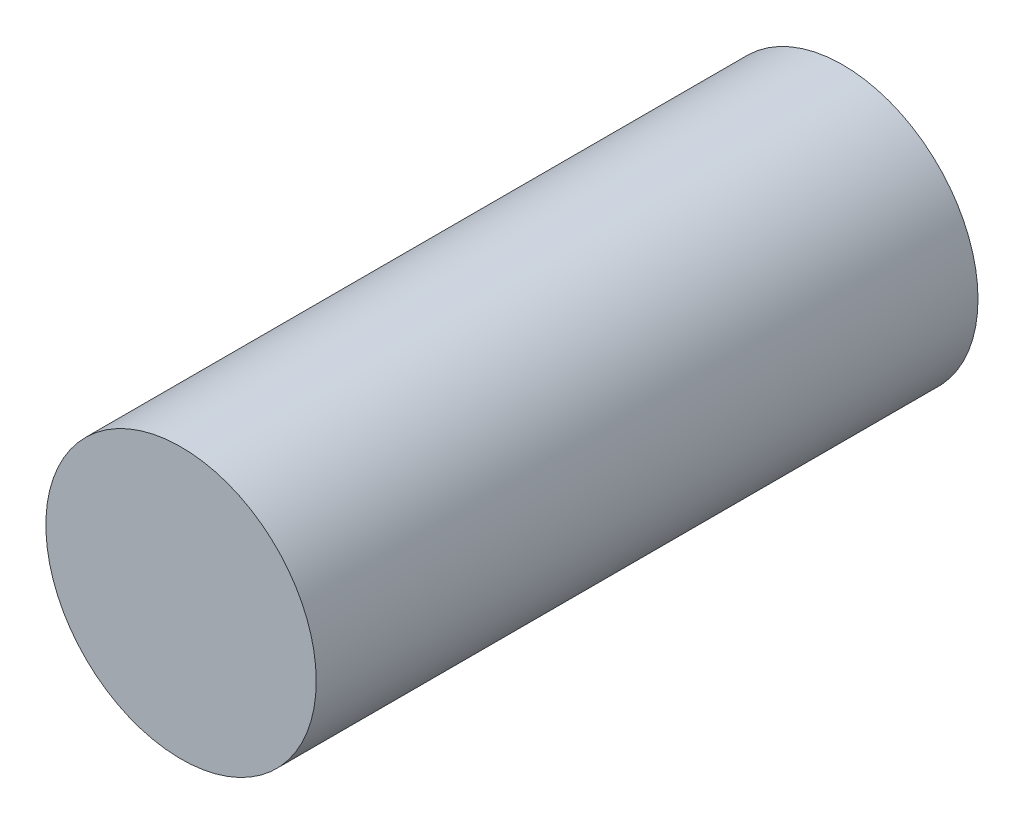
ISO-10303-21;
HEADER;
FILE_DESCRIPTION(('STEP AP214'),'2;1');
FILE_NAME('part.step','',(''),(''),'','','');
FILE_SCHEMA(('AUTOMOTIVE_DESIGN { 1 0 10303 214 1 1 1 1 }'));
ENDSEC;
DATA;
#1=APPLICATION_CONTEXT('core data for automotive mechanical design processes');
#2=APPLICATION_PROTOCOL_DEFINITION('international standard','automotive_design',2000,#1);
#3=PRODUCT_CONTEXT('',#1,'mechanical');
#4=PRODUCT('Part','Part','',(#3));
#5=PRODUCT_RELATED_PRODUCT_CATEGORY('part','',(#4));
#6=PRODUCT_DEFINITION_FORMATION('','',#4);
#7=PRODUCT_DEFINITION_CONTEXT('part definition',#1,'design');
#8=PRODUCT_DEFINITION('design','',#6,#7);
#9=PRODUCT_DEFINITION_SHAPE('','',#8);
#10=(LENGTH_UNIT() NAMED_UNIT(*) SI_UNIT(.MILLI.,.METRE.));
#11=(NAMED_UNIT(*) PLANE_ANGLE_UNIT() SI_UNIT($,.RADIAN.));
#12=(NAMED_UNIT(*) SI_UNIT($,.STERADIAN.) SOLID_ANGLE_UNIT());
#13=UNCERTAINTY_MEASURE_WITH_UNIT(LENGTH_MEASURE(1.E-05),#10,'distance_accuracy_value','');
#14=(GEOMETRIC_REPRESENTATION_CONTEXT(3) GLOBAL_UNCERTAINTY_ASSIGNED_CONTEXT((#13)) GLOBAL_UNIT_ASSIGNED_CONTEXT((#10,
#11,#12)) REPRESENTATION_CONTEXT('',''));
#15=CARTESIAN_POINT('',(0.,0.,0.));
#16=DIRECTION('',(0.,0.,1.));
#17=DIRECTION('',(1.,0.,0.));
#18=AXIS2_PLACEMENT_3D('',#15,#16,#17);
#19=CARTESIAN_POINT('',(0.,0.,14.44));
#20=DIRECTION('',(0.,0.,-1.));
#21=DIRECTION('',(-1.,0.,0.));
#22=AXIS2_PLACEMENT_3D('',#19,#20,#21);
#23=CYLINDRICAL_SURFACE('',#22,2.95);
#24=CARTESIAN_POINT('',(0.,0.,14.44));
#25=DIRECTION('',(0.,0.,1.));
#26=DIRECTION('',(1.,0.,0.));
#27=AXIS2_PLACEMENT_3D('',#24,#25,#26);
#28=CIRCLE('',#27,2.95);
#29=CARTESIAN_POINT('',(2.95,0.,14.44));
#30=VERTEX_POINT('',#29);
#31=EDGE_CURVE('E10',#30,#30,#28,.T.);
#32=ORIENTED_EDGE('',*,*,#31,.F.);
#33=EDGE_LOOP('',(#32));
#34=FACE_BOUND('',#33,.T.);
#35=CARTESIAN_POINT('',(0.,0.,0.));
#36=DIRECTION('',(0.,0.,1.));
#37=DIRECTION('',(1.,0.,0.));
#38=AXIS2_PLACEMENT_3D('',#35,#36,#37);
#39=CIRCLE('',#38,2.95);
#40=CARTESIAN_POINT('',(2.95,0.,0.));
#41=VERTEX_POINT('',#40);
#42=EDGE_CURVE('E40',#41,#41,#39,.T.);
#43=ORIENTED_EDGE('',*,*,#42,.T.);
#44=EDGE_LOOP('',(#43));
#45=FACE_BOUND('',#44,.T.);
#46=ADVANCED_FACE('F37',(#34,#45),#23,.T.);
#47=CARTESIAN_POINT('',(0.,0.,14.44));
#48=DIRECTION('',(0.,0.,1.));
#49=DIRECTION('',(1.,0.,0.));
#50=AXIS2_PLACEMENT_3D('',#47,#48,#49);
#51=PLANE('',#50);
#52=ORIENTED_EDGE('',*,*,#31,.T.);
#53=EDGE_LOOP('',(#52));
#54=FACE_BOUND('',#53,.T.);
#55=ADVANCED_FACE('F52',(#54),#51,.T.);
#56=CARTESIAN_POINT('',(0.,0.,0.));
#57=DIRECTION('',(0.,0.,1.));
#58=DIRECTION('',(1.,0.,0.));
#59=AXIS2_PLACEMENT_3D('',#56,#57,#58);
#60=PLANE('',#59);
#61=ORIENTED_EDGE('',*,*,#42,.F.);
#62=EDGE_LOOP('',(#61));
#63=FACE_BOUND('',#62,.T.);
#64=ADVANCED_FACE('F50',(#63),#60,.F.);
#65=CLOSED_SHELL('',(#46,#55,#64));
#66=MANIFOLD_SOLID_BREP('B2',#65);
#67=ADVANCED_BREP_SHAPE_REPRESENTATION('',(#18,#66),#14);
#68=SHAPE_DEFINITION_REPRESENTATION(#9,#67);
ENDSEC;
END-ISO-10303-21;
